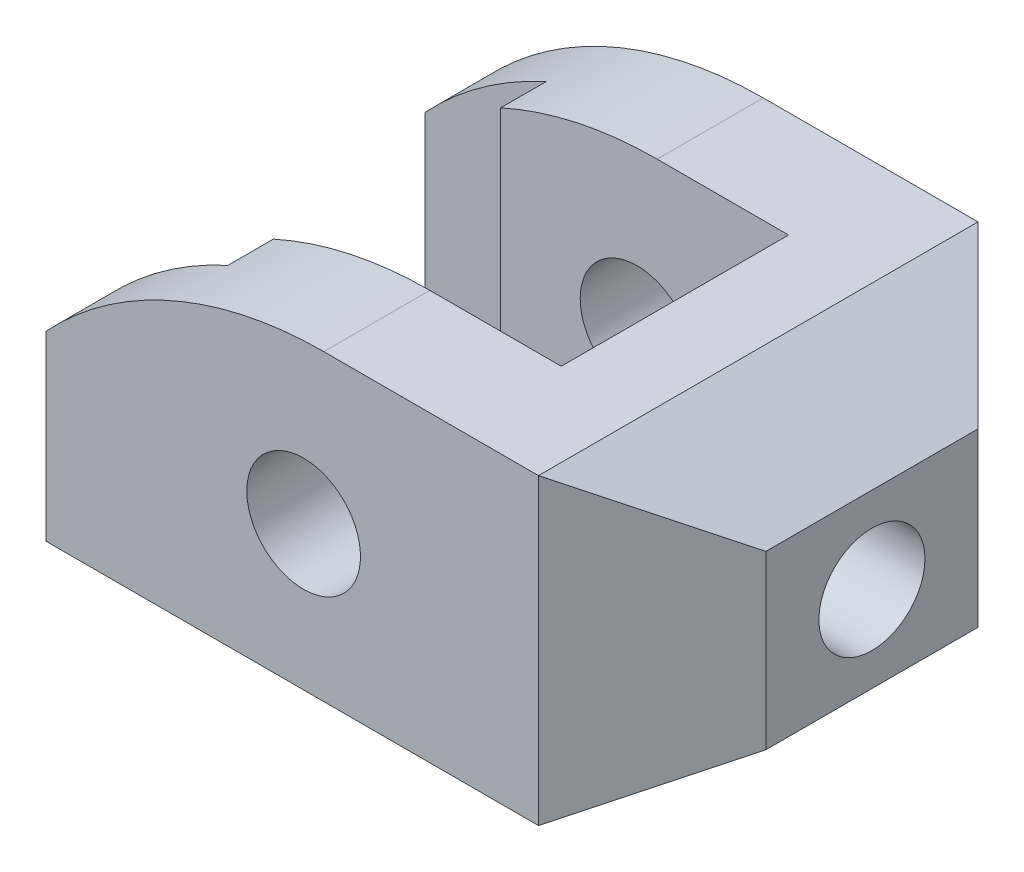
ISO-10303-21;
HEADER;
FILE_DESCRIPTION(('STEP AP214'),'2;1');
FILE_NAME('part.step','',(''),(''),'','','');
FILE_SCHEMA(('AUTOMOTIVE_DESIGN { 1 0 10303 214 1 1 1 1 }'));
ENDSEC;
DATA;
#1=APPLICATION_CONTEXT('core data for automotive mechanical design processes');
#2=APPLICATION_PROTOCOL_DEFINITION('international standard','automotive_design',2000,#1);
#3=PRODUCT_CONTEXT('',#1,'mechanical');
#4=PRODUCT('Part','Part','',(#3));
#5=PRODUCT_RELATED_PRODUCT_CATEGORY('part','',(#4));
#6=PRODUCT_DEFINITION_FORMATION('','',#4);
#7=PRODUCT_DEFINITION_CONTEXT('part definition',#1,'design');
#8=PRODUCT_DEFINITION('design','',#6,#7);
#9=PRODUCT_DEFINITION_SHAPE('','',#8);
#10=(LENGTH_UNIT() NAMED_UNIT(*) SI_UNIT(.MILLI.,.METRE.));
#11=(NAMED_UNIT(*) PLANE_ANGLE_UNIT() SI_UNIT($,.RADIAN.));
#12=(NAMED_UNIT(*) SI_UNIT($,.STERADIAN.) SOLID_ANGLE_UNIT());
#13=UNCERTAINTY_MEASURE_WITH_UNIT(LENGTH_MEASURE(1.E-05),#10,'distance_accuracy_value','');
#14=(GEOMETRIC_REPRESENTATION_CONTEXT(3) GLOBAL_UNCERTAINTY_ASSIGNED_CONTEXT((#13)) GLOBAL_UNIT_ASSIGNED_CONTEXT((#10,
#11,#12)) REPRESENTATION_CONTEXT('',''));
#15=CARTESIAN_POINT('',(0.,0.,0.));
#16=DIRECTION('',(0.,0.,1.));
#17=DIRECTION('',(1.,0.,0.));
#18=AXIS2_PLACEMENT_3D('',#15,#16,#17);
#19=CARTESIAN_POINT('',(2.66060555964673,-29.,58.));
#20=DIRECTION('',(0.,0.,-1.));
#21=DIRECTION('',(-1.,0.,0.));
#22=AXIS2_PLACEMENT_3D('',#19,#20,#21);
#23=CYLINDRICAL_SURFACE('',#22,50.);
#24=DIRECTION('',(0.,0.,-1.));
#25=VECTOR('',#24,1.);
#26=CARTESIAN_POINT('',(-18.,16.5317403347236,58.));
#27=LINE('',#26,#25);
#28=CARTESIAN_POINT('',(-18.,16.5317403347236,44.));
#29=VERTEX_POINT('',#28);
#30=CARTESIAN_POINT('',(-18.,16.5317403347236,50.));
#31=VERTEX_POINT('',#30);
#32=EDGE_CURVE('E276',#29,#31,#27,.F.);
#33=ORIENTED_EDGE('',*,*,#32,.T.);
#34=CARTESIAN_POINT('',(2.66060555964673,-29.,50.));
#35=DIRECTION('',(0.,0.,1.));
#36=DIRECTION('',(1.,0.,0.));
#37=AXIS2_PLACEMENT_3D('',#34,#35,#36);
#38=CIRCLE('',#37,50.);
#39=CARTESIAN_POINT('',(-34.,5.00000000000001,50.));
#40=VERTEX_POINT('',#39);
#41=EDGE_CURVE('E279',#31,#40,#38,.T.);
#42=ORIENTED_EDGE('',*,*,#41,.T.);
#43=DIRECTION('',(0.,0.,-1.));
#44=VECTOR('',#43,1.);
#45=CARTESIAN_POINT('',(-34.,5.,58.));
#46=LINE('',#45,#44);
#47=CARTESIAN_POINT('',(-34.,5.,58.));
#48=VERTEX_POINT('',#47);
#49=EDGE_CURVE('E190',#48,#40,#46,.T.);
#50=ORIENTED_EDGE('',*,*,#49,.F.);
#51=CARTESIAN_POINT('',(2.66060555964673,-29.,58.));
#52=DIRECTION('',(0.,0.,1.));
#53=DIRECTION('',(-1.,0.,0.));
#54=AXIS2_PLACEMENT_3D('',#51,#52,#53);
#55=CIRCLE('',#54,50.);
#56=CARTESIAN_POINT('',(2.66060555964672,21.,58.));
#57=VERTEX_POINT('',#56);
#58=EDGE_CURVE('E289',#57,#48,#55,.T.);
#59=ORIENTED_EDGE('',*,*,#58,.F.);
#60=DIRECTION('',(0.,0.,-1.));
#61=VECTOR('',#60,1.);
#62=CARTESIAN_POINT('',(2.66060555964672,21.,58.));
#63=LINE('',#62,#61);
#64=CARTESIAN_POINT('',(2.66060555964672,21.,44.));
#65=VERTEX_POINT('',#64);
#66=EDGE_CURVE('E307',#57,#65,#63,.T.);
#67=ORIENTED_EDGE('',*,*,#66,.T.);
#68=CARTESIAN_POINT('',(2.66060555964673,-29.,44.));
#69=DIRECTION('',(0.,0.,1.));
#70=DIRECTION('',(1.,0.,0.));
#71=AXIS2_PLACEMENT_3D('',#68,#69,#70);
#72=CIRCLE('',#71,50.);
#73=EDGE_CURVE('E267',#65,#29,#72,.T.);
#74=ORIENTED_EDGE('',*,*,#73,.T.);
#75=EDGE_LOOP('',(#33,#42,#50,#59,#67,#74));
#76=FACE_BOUND('',#75,.T.);
#77=ADVANCED_FACE('F43',(#76),#23,.T.);
#78=CARTESIAN_POINT('',(-34.,5.,58.));
#79=DIRECTION('',(1.,0.,0.));
#80=DIRECTION('',(0.,1.,0.));
#81=AXIS2_PLACEMENT_3D('',#78,#79,#80);
#82=PLANE('',#81);
#83=ORIENTED_EDGE('',*,*,#49,.T.);
#84=DIRECTION('',(0.,-1.,0.));
#85=VECTOR('',#84,1.);
#86=CARTESIAN_POINT('',(-34.,39.,50.));
#87=LINE('',#86,#85);
#88=CARTESIAN_POINT('',(-34.,-19.,50.));
#89=VERTEX_POINT('',#88);
#90=EDGE_CURVE('E198',#40,#89,#87,.T.);
#91=ORIENTED_EDGE('',*,*,#90,.T.);
#92=DIRECTION('',(0.,0.,-1.));
#93=VECTOR('',#92,1.);
#94=CARTESIAN_POINT('',(-34.,-19.,58.));
#95=LINE('',#94,#93);
#96=CARTESIAN_POINT('',(-34.,-19.,58.));
#97=VERTEX_POINT('',#96);
#98=EDGE_CURVE('E186',#97,#89,#95,.T.);
#99=ORIENTED_EDGE('',*,*,#98,.F.);
#100=DIRECTION('',(0.,-1.,0.));
#101=VECTOR('',#100,1.);
#102=CARTESIAN_POINT('',(-34.,5.,58.));
#103=LINE('',#102,#101);
#104=EDGE_CURVE('E291',#48,#97,#103,.T.);
#105=ORIENTED_EDGE('',*,*,#104,.F.);
#106=EDGE_LOOP('',(#83,#91,#99,#105));
#107=FACE_BOUND('',#106,.T.);
#108=ADVANCED_FACE('F352',(#107),#82,.F.);
#109=CARTESIAN_POINT('',(0.,0.,58.));
#110=DIRECTION('',(0.,0.,-1.));
#111=DIRECTION('',(-1.,0.,0.));
#112=AXIS2_PLACEMENT_3D('',#109,#110,#111);
#113=CYLINDRICAL_SURFACE('',#112,7.5);
#114=CARTESIAN_POINT('',(0.,0.,44.));
#115=DIRECTION('',(0.,0.,1.));
#116=DIRECTION('',(1.,0.,0.));
#117=AXIS2_PLACEMENT_3D('',#114,#115,#116);
#118=CIRCLE('',#117,7.5);
#119=CARTESIAN_POINT('',(-7.5,0.,44.));
#120=VERTEX_POINT('',#119);
#121=EDGE_CURVE('E199',#120,#120,#118,.T.);
#122=CARTESIAN_POINT('',(0.,0.,58.));
#123=DIRECTION('',(0.,0.,1.));
#124=DIRECTION('',(1.,0.,0.));
#125=AXIS2_PLACEMENT_3D('',#122,#123,#124);
#126=CIRCLE('',#125,7.5);
#127=CARTESIAN_POINT('',(-7.5,0.,58.));
#128=VERTEX_POINT('',#127);
#129=EDGE_CURVE('E283',#128,#128,#126,.T.);
#130=CARTESIAN_POINT('',(-7.5,0.,44.));
#131=CARTESIAN_POINT('',(-7.5,0.,44.1458333333333));
#132=CARTESIAN_POINT('',(-7.5,0.,44.2916666666667));
#133=CARTESIAN_POINT('',(-7.5,0.,44.5833333333333));
#134=CARTESIAN_POINT('',(-7.5,0.,44.7291666666667));
#135=CARTESIAN_POINT('',(-7.5,0.,45.0208333333333));
#136=CARTESIAN_POINT('',(-7.5,0.,45.1666666666667));
#137=CARTESIAN_POINT('',(-7.5,0.,45.4583333333333));
#138=CARTESIAN_POINT('',(-7.5,0.,45.6041666666667));
#139=CARTESIAN_POINT('',(-7.5,0.,45.8958333333333));
#140=CARTESIAN_POINT('',(-7.5,0.,46.0416666666667));
#141=CARTESIAN_POINT('',(-7.5,0.,46.3333333333333));
#142=CARTESIAN_POINT('',(-7.5,0.,46.4791666666667));
#143=CARTESIAN_POINT('',(-7.5,0.,46.7708333333333));
#144=CARTESIAN_POINT('',(-7.5,0.,46.9166666666667));
#145=CARTESIAN_POINT('',(-7.5,0.,47.2083333333333));
#146=CARTESIAN_POINT('',(-7.5,0.,47.3541666666667));
#147=CARTESIAN_POINT('',(-7.5,0.,47.6458333333333));
#148=CARTESIAN_POINT('',(-7.5,0.,47.7916666666667));
#149=CARTESIAN_POINT('',(-7.5,0.,48.0833333333333));
#150=CARTESIAN_POINT('',(-7.5,0.,48.2291666666667));
#151=CARTESIAN_POINT('',(-7.5,0.,48.5208333333333));
#152=CARTESIAN_POINT('',(-7.5,0.,48.6666666666667));
#153=CARTESIAN_POINT('',(-7.5,0.,48.9583333333333));
#154=CARTESIAN_POINT('',(-7.5,0.,49.1041666666667));
#155=CARTESIAN_POINT('',(-7.5,0.,49.3958333333333));
#156=CARTESIAN_POINT('',(-7.5,0.,49.5416666666667));
#157=CARTESIAN_POINT('',(-7.5,0.,49.8333333333333));
#158=CARTESIAN_POINT('',(-7.5,0.,49.9791666666667));
#159=CARTESIAN_POINT('',(-7.5,0.,50.2708333333333));
#160=CARTESIAN_POINT('',(-7.5,0.,50.4166666666667));
#161=CARTESIAN_POINT('',(-7.5,0.,50.7083333333333));
#162=CARTESIAN_POINT('',(-7.5,0.,50.8541666666667));
#163=CARTESIAN_POINT('',(-7.5,0.,51.1458333333333));
#164=CARTESIAN_POINT('',(-7.5,0.,51.2916666666667));
#165=CARTESIAN_POINT('',(-7.5,0.,51.5833333333333));
#166=CARTESIAN_POINT('',(-7.5,0.,51.7291666666667));
#167=CARTESIAN_POINT('',(-7.5,0.,52.0208333333333));
#168=CARTESIAN_POINT('',(-7.5,0.,52.1666666666667));
#169=CARTESIAN_POINT('',(-7.5,0.,52.4583333333333));
#170=CARTESIAN_POINT('',(-7.5,0.,52.6041666666667));
#171=CARTESIAN_POINT('',(-7.5,0.,52.8958333333333));
#172=CARTESIAN_POINT('',(-7.5,0.,53.0416666666667));
#173=CARTESIAN_POINT('',(-7.5,0.,53.3333333333333));
#174=CARTESIAN_POINT('',(-7.5,0.,53.4791666666667));
#175=CARTESIAN_POINT('',(-7.5,0.,53.7708333333333));
#176=CARTESIAN_POINT('',(-7.5,0.,53.9166666666667));
#177=CARTESIAN_POINT('',(-7.5,0.,54.2083333333333));
#178=CARTESIAN_POINT('',(-7.5,0.,54.3541666666667));
#179=CARTESIAN_POINT('',(-7.5,0.,54.6458333333333));
#180=CARTESIAN_POINT('',(-7.5,0.,54.7916666666667));
#181=CARTESIAN_POINT('',(-7.5,0.,55.0833333333333));
#182=CARTESIAN_POINT('',(-7.5,0.,55.2291666666667));
#183=CARTESIAN_POINT('',(-7.5,0.,55.5208333333333));
#184=CARTESIAN_POINT('',(-7.5,0.,55.6666666666667));
#185=CARTESIAN_POINT('',(-7.5,0.,55.9583333333333));
#186=CARTESIAN_POINT('',(-7.5,0.,56.1041666666667));
#187=CARTESIAN_POINT('',(-7.5,0.,56.3958333333333));
#188=CARTESIAN_POINT('',(-7.5,0.,56.5416666666667));
#189=CARTESIAN_POINT('',(-7.5,0.,56.8333333333333));
#190=CARTESIAN_POINT('',(-7.5,0.,56.9791666666667));
#191=CARTESIAN_POINT('',(-7.5,0.,57.2708333333333));
#192=CARTESIAN_POINT('',(-7.5,0.,57.4166666666667));
#193=CARTESIAN_POINT('',(-7.5,0.,57.7083333333333));
#194=CARTESIAN_POINT('',(-7.5,0.,57.8541666666667));
#195=CARTESIAN_POINT('',(-7.5,0.,58.));
#196=B_SPLINE_CURVE_WITH_KNOTS('',3,(#130,#131,#132,#133,#134,#135,#136,#137,#138,#139,#140,
#141,#142,#143,#144,#145,#146,#147,#148,#149,#150,#151,#152,#153,#154,#155,#156,#157,#158,#159,
#160,#161,#162,#163,#164,#165,#166,#167,#168,#169,#170,#171,#172,#173,#174,#175,#176,#177,#178,
#179,#180,#181,#182,#183,#184,#185,#186,#187,#188,#189,#190,#191,#192,#193,#194,#195),
.UNSPECIFIED.,.F.,.F.,(4,2,2,2,2,2,2,2,2,2,2,2,2,2,2,2,2,2,2,2,2,2,2,2,2,2,2,2,2,2,2,2,4),(0.,
0.4375,0.875000000000001,1.3125,1.74999999999999,2.1875,2.625,3.0625,3.5,3.9375,4.375,4.8125,
5.25,5.6875,6.125,6.5625,7.,7.4375,7.875,8.31249999999999,8.74999999999999,9.18749999999999,
9.62499999999999,10.0625,10.5,10.9375,11.375,11.8125,12.25,12.6875,13.125,13.5625,14.),.UNSPECIFIED.);
#197=EDGE_CURVE('BSEAM373',#120,#128,#196,.T.);
#198=ORIENTED_EDGE('',*,*,#121,.F.);
#199=ORIENTED_EDGE('',*,*,#129,.T.);
#200=ORIENTED_EDGE('',*,*,#197,.T.);
#201=ORIENTED_EDGE('',*,*,#197,.F.);
#202=EDGE_LOOP('',(#198,#200,#199,#201));
#203=FACE_BOUND('',#202,.T.);
#204=ADVANCED_FACE('F373',(#203),#113,.F.);
#205=CARTESIAN_POINT('',(2.66060555964673,-29.,58.));
#206=DIRECTION('',(0.,0.,-1.));
#207=DIRECTION('',(-1.,0.,0.));
#208=AXIS2_PLACEMENT_3D('',#205,#206,#207);
#209=PLANE('',#208);
#210=DIRECTION('',(1.,0.,0.));
#211=VECTOR('',#210,1.);
#212=CARTESIAN_POINT('',(-34.,-19.,58.));
#213=LINE('',#212,#211);
#214=CARTESIAN_POINT('',(31.,-19.,58.));
#215=VERTEX_POINT('',#214);
#216=EDGE_CURVE('E218',#97,#215,#213,.T.);
#217=ORIENTED_EDGE('',*,*,#216,.T.);
#218=DIRECTION('',(0.,1.,0.));
#219=VECTOR('',#218,1.);
#220=CARTESIAN_POINT('',(31.,-29.,58.));
#221=LINE('',#220,#219);
#222=CARTESIAN_POINT('',(31.,21.,58.));
#223=VERTEX_POINT('',#222);
#224=EDGE_CURVE('E158',#215,#223,#221,.T.);
#225=ORIENTED_EDGE('',*,*,#224,.T.);
#226=DIRECTION('',(-1.,0.,0.));
#227=VECTOR('',#226,1.);
#228=CARTESIAN_POINT('',(31.,21.,58.));
#229=LINE('',#228,#227);
#230=EDGE_CURVE('E215',#223,#57,#229,.T.);
#231=ORIENTED_EDGE('',*,*,#230,.T.);
#232=ORIENTED_EDGE('',*,*,#58,.T.);
#233=ORIENTED_EDGE('',*,*,#104,.T.);
#234=EDGE_LOOP('',(#217,#225,#231,#232,#233));
#235=FACE_BOUND('',#234,.T.);
#236=ORIENTED_EDGE('',*,*,#129,.F.);
#237=EDGE_LOOP('',(#236));
#238=FACE_BOUND('',#237,.T.);
#239=ADVANCED_FACE('F212',(#235,#238),#209,.F.);
#240=CARTESIAN_POINT('',(2.66060555964673,-29.,0.));
#241=DIRECTION('',(0.,0.,-1.));
#242=DIRECTION('',(-1.,0.,0.));
#243=AXIS2_PLACEMENT_3D('',#240,#241,#242);
#244=PLANE('',#243);
#245=DIRECTION('',(0.,1.,0.));
#246=VECTOR('',#245,1.);
#247=CARTESIAN_POINT('',(31.,-29.,0.));
#248=LINE('',#247,#246);
#249=CARTESIAN_POINT('',(31.,-19.,0.));
#250=VERTEX_POINT('',#249);
#251=CARTESIAN_POINT('',(31.,21.,0.));
#252=VERTEX_POINT('',#251);
#253=EDGE_CURVE('E164',#250,#252,#248,.T.);
#254=ORIENTED_EDGE('',*,*,#253,.F.);
#255=DIRECTION('',(1.,0.,0.));
#256=VECTOR('',#255,1.);
#257=CARTESIAN_POINT('',(-34.,-19.,0.));
#258=LINE('',#257,#256);
#259=CARTESIAN_POINT('',(-34.,-19.,0.));
#260=VERTEX_POINT('',#259);
#261=EDGE_CURVE('E302',#260,#250,#258,.T.);
#262=ORIENTED_EDGE('',*,*,#261,.F.);
#263=DIRECTION('',(0.,-1.,0.));
#264=VECTOR('',#263,1.);
#265=CARTESIAN_POINT('',(-34.,5.,0.));
#266=LINE('',#265,#264);
#267=CARTESIAN_POINT('',(-34.,5.,0.));
#268=VERTEX_POINT('',#267);
#269=EDGE_CURVE('E299',#268,#260,#266,.T.);
#270=ORIENTED_EDGE('',*,*,#269,.F.);
#271=CARTESIAN_POINT('',(2.66060555964673,-29.,0.));
#272=DIRECTION('',(0.,0.,1.));
#273=DIRECTION('',(-1.,0.,0.));
#274=AXIS2_PLACEMENT_3D('',#271,#272,#273);
#275=CIRCLE('',#274,50.);
#276=CARTESIAN_POINT('',(2.66060555964672,21.,0.));
#277=VERTEX_POINT('',#276);
#278=EDGE_CURVE('E286',#277,#268,#275,.T.);
#279=ORIENTED_EDGE('',*,*,#278,.F.);
#280=DIRECTION('',(-1.,0.,0.));
#281=VECTOR('',#280,1.);
#282=CARTESIAN_POINT('',(31.,21.,0.));
#283=LINE('',#282,#281);
#284=EDGE_CURVE('E292',#252,#277,#283,.T.);
#285=ORIENTED_EDGE('',*,*,#284,.F.);
#286=EDGE_LOOP('',(#254,#262,#270,#279,#285));
#287=FACE_BOUND('',#286,.T.);
#288=CARTESIAN_POINT('',(0.,0.,0.));
#289=DIRECTION('',(0.,0.,1.));
#290=DIRECTION('',(1.,0.,0.));
#291=AXIS2_PLACEMENT_3D('',#288,#289,#290);
#292=CIRCLE('',#291,7.5);
#293=CARTESIAN_POINT('',(-7.5,0.,0.));
#294=VERTEX_POINT('',#293);
#295=EDGE_CURVE('E282',#294,#294,#292,.T.);
#296=ORIENTED_EDGE('',*,*,#295,.T.);
#297=EDGE_LOOP('',(#296));
#298=FACE_BOUND('',#297,.T.);
#299=ADVANCED_FACE('F316',(#287,#298),#244,.T.);
#300=DIRECTION('',(0.,0.,-1.));
#301=VECTOR('',#300,1.);
#302=CARTESIAN_POINT('',(-18.,16.5317403347236,58.));
#303=LINE('',#302,#301);
#304=CARTESIAN_POINT('',(-18.,16.5317403347236,8.));
#305=VERTEX_POINT('',#304);
#306=CARTESIAN_POINT('',(-18.,16.5317403347236,14.));
#307=VERTEX_POINT('',#306);
#308=EDGE_CURVE('E273',#305,#307,#303,.F.);
#309=ORIENTED_EDGE('',*,*,#308,.T.);
#310=CARTESIAN_POINT('',(2.66060555964673,-29.,14.));
#311=DIRECTION('',(0.,0.,-1.));
#312=DIRECTION('',(-1.,0.,0.));
#313=AXIS2_PLACEMENT_3D('',#310,#311,#312);
#314=CIRCLE('',#313,50.);
#315=CARTESIAN_POINT('',(2.66060555964672,21.,14.));
#316=VERTEX_POINT('',#315);
#317=EDGE_CURVE('E203',#307,#316,#314,.T.);
#318=ORIENTED_EDGE('',*,*,#317,.T.);
#319=EDGE_CURVE('E296',#316,#277,#63,.T.);
#320=ORIENTED_EDGE('',*,*,#319,.T.);
#321=ORIENTED_EDGE('',*,*,#278,.T.);
#322=CARTESIAN_POINT('',(-34.,5.00000000000001,8.));
#323=VERTEX_POINT('',#322);
#324=EDGE_CURVE('E189',#323,#268,#46,.T.);
#325=ORIENTED_EDGE('',*,*,#324,.F.);
#326=CARTESIAN_POINT('',(2.66060555964673,-29.,8.));
#327=DIRECTION('',(0.,0.,-1.));
#328=DIRECTION('',(-1.,0.,0.));
#329=AXIS2_PLACEMENT_3D('',#326,#327,#328);
#330=CIRCLE('',#329,50.);
#331=EDGE_CURVE('E270',#323,#305,#330,.T.);
#332=ORIENTED_EDGE('',*,*,#331,.T.);
#333=EDGE_LOOP('',(#309,#318,#320,#321,#325,#332));
#334=FACE_BOUND('',#333,.T.);
#335=ADVANCED_FACE('F45',(#334),#23,.T.);
#336=CARTESIAN_POINT('',(-34.,-19.,8.));
#337=VERTEX_POINT('',#336);
#338=EDGE_CURVE('E180',#337,#260,#95,.T.);
#339=ORIENTED_EDGE('',*,*,#338,.F.);
#340=DIRECTION('',(0.,-1.,0.));
#341=VECTOR('',#340,1.);
#342=CARTESIAN_POINT('',(-34.,39.,8.));
#343=LINE('',#342,#341);
#344=EDGE_CURVE('E246',#323,#337,#343,.T.);
#345=ORIENTED_EDGE('',*,*,#344,.F.);
#346=ORIENTED_EDGE('',*,*,#324,.T.);
#347=ORIENTED_EDGE('',*,*,#269,.T.);
#348=EDGE_LOOP('',(#339,#345,#346,#347));
#349=FACE_BOUND('',#348,.T.);
#350=ADVANCED_FACE('F335',(#349),#82,.F.);
#351=CARTESIAN_POINT('',(-34.,-19.,58.));
#352=DIRECTION('',(0.,1.,0.));
#353=DIRECTION('',(-1.,0.,0.));
#354=AXIS2_PLACEMENT_3D('',#351,#352,#353);
#355=PLANE('',#354);
#356=ORIENTED_EDGE('',*,*,#98,.T.);
#357=DIRECTION('',(-1.,0.,0.));
#358=VECTOR('',#357,1.);
#359=CARTESIAN_POINT('',(-34.,-19.,50.));
#360=LINE('',#359,#358);
#361=CARTESIAN_POINT('',(-18.,-19.,50.));
#362=VERTEX_POINT('',#361);
#363=EDGE_CURVE('E244',#362,#89,#360,.T.);
#364=ORIENTED_EDGE('',*,*,#363,.F.);
#365=DIRECTION('',(0.,0.,1.));
#366=VECTOR('',#365,1.);
#367=CARTESIAN_POINT('',(-18.,-19.,50.));
#368=LINE('',#367,#366);
#369=CARTESIAN_POINT('',(-18.,-19.,44.));
#370=VERTEX_POINT('',#369);
#371=EDGE_CURVE('E241',#370,#362,#368,.T.);
#372=ORIENTED_EDGE('',*,*,#371,.F.);
#373=DIRECTION('',(-1.,0.,0.));
#374=VECTOR('',#373,1.);
#375=CARTESIAN_POINT('',(-18.,-19.,44.));
#376=LINE('',#375,#374);
#377=CARTESIAN_POINT('',(20.,-19.,44.));
#378=VERTEX_POINT('',#377);
#379=EDGE_CURVE('E238',#378,#370,#376,.T.);
#380=ORIENTED_EDGE('',*,*,#379,.F.);
#381=DIRECTION('',(0.,0.,1.));
#382=VECTOR('',#381,1.);
#383=CARTESIAN_POINT('',(20.,-19.,44.));
#384=LINE('',#383,#382);
#385=CARTESIAN_POINT('',(20.,-19.,14.));
#386=VERTEX_POINT('',#385);
#387=EDGE_CURVE('E235',#386,#378,#384,.T.);
#388=ORIENTED_EDGE('',*,*,#387,.F.);
#389=DIRECTION('',(1.,0.,0.));
#390=VECTOR('',#389,1.);
#391=CARTESIAN_POINT('',(20.,-19.,14.));
#392=LINE('',#391,#390);
#393=CARTESIAN_POINT('',(-18.,-19.,14.));
#394=VERTEX_POINT('',#393);
#395=EDGE_CURVE('E233',#394,#386,#392,.T.);
#396=ORIENTED_EDGE('',*,*,#395,.F.);
#397=DIRECTION('',(0.,0.,1.));
#398=VECTOR('',#397,1.);
#399=CARTESIAN_POINT('',(-18.,-19.,14.));
#400=LINE('',#399,#398);
#401=CARTESIAN_POINT('',(-18.,-19.,8.));
#402=VERTEX_POINT('',#401);
#403=EDGE_CURVE('E230',#402,#394,#400,.T.);
#404=ORIENTED_EDGE('',*,*,#403,.F.);
#405=DIRECTION('',(1.,0.,0.));
#406=VECTOR('',#405,1.);
#407=CARTESIAN_POINT('',(-18.,-19.,8.));
#408=LINE('',#407,#406);
#409=EDGE_CURVE('E227',#337,#402,#408,.T.);
#410=ORIENTED_EDGE('',*,*,#409,.F.);
#411=ORIENTED_EDGE('',*,*,#338,.T.);
#412=ORIENTED_EDGE('',*,*,#261,.T.);
#413=DIRECTION('',(0.,0.,-1.));
#414=VECTOR('',#413,1.);
#415=CARTESIAN_POINT('',(31.,-19.,58.));
#416=LINE('',#415,#414);
#417=EDGE_CURVE('E178',#215,#250,#416,.T.);
#418=ORIENTED_EDGE('',*,*,#417,.F.);
#419=ORIENTED_EDGE('',*,*,#216,.F.);
#420=EDGE_LOOP('',(#356,#364,#372,#380,#388,#396,#404,#410,#411,#412,#418,#419));
#421=FACE_BOUND('',#420,.T.);
#422=ADVANCED_FACE('F337',(#421),#355,.F.);
#423=CARTESIAN_POINT('',(31.,-19.,58.));
#424=DIRECTION('',(-0.500000000000001,0.866025403784438,0.));
#425=DIRECTION('',(-0.866025403784438,-0.500000000000001,0.));
#426=AXIS2_PLACEMENT_3D('',#423,#424,#425);
#427=PLANE('',#426);
#428=ORIENTED_EDGE('',*,*,#417,.T.);
#429=DIRECTION('',(0.654653670707976,0.377964473009228,0.654653670707978));
#430=VECTOR('',#429,1.);
#431=CARTESIAN_POINT('',(55.8571428571428,-4.64872188014355,24.8571428571429));
#432=LINE('',#431,#430);
#433=CARTESIAN_POINT('',(46.,-10.3397459621556,15.0000000000001));
#434=VERTEX_POINT('',#433);
#435=EDGE_CURVE('E163',#250,#434,#432,.T.);
#436=ORIENTED_EDGE('',*,*,#435,.T.);
#437=DIRECTION('',(0.,0.,-1.));
#438=VECTOR('',#437,1.);
#439=CARTESIAN_POINT('',(46.,-10.3397459621556,58.));
#440=LINE('',#439,#438);
#441=CARTESIAN_POINT('',(46.,-10.3397459621556,43.0000000000002));
#442=VERTEX_POINT('',#441);
#443=EDGE_CURVE('E171',#442,#434,#440,.T.);
#444=ORIENTED_EDGE('',*,*,#443,.F.);
#445=DIRECTION('',(-0.65465367070798,-0.37796447300923,0.654653670707973));
#446=VECTOR('',#445,1.);
#447=CARTESIAN_POINT('',(31.,-19.,58.));
#448=LINE('',#447,#446);
#449=EDGE_CURVE('E155',#442,#215,#448,.T.);
#450=ORIENTED_EDGE('',*,*,#449,.T.);
#451=EDGE_LOOP('',(#428,#436,#444,#450));
#452=FACE_BOUND('',#451,.T.);
#453=ADVANCED_FACE('F177',(#452),#427,.F.);
#454=CARTESIAN_POINT('',(46.,-10.3397459621556,58.));
#455=DIRECTION('',(-1.,0.,0.));
#456=DIRECTION('',(0.,0.,1.));
#457=AXIS2_PLACEMENT_3D('',#454,#455,#456);
#458=PLANE('',#457);
#459=CARTESIAN_POINT('',(46.,1.00000000000007,29.0000000000001));
#460=DIRECTION('',(-1.,0.,0.));
#461=DIRECTION('',(0.,0.,1.));
#462=AXIS2_PLACEMENT_3D('',#459,#460,#461);
#463=CIRCLE('',#462,7.);
#464=CARTESIAN_POINT('',(46.,1.00000000000007,22.0000000000001));
#465=VERTEX_POINT('',#464);
#466=EDGE_CURVE('E220',#465,#465,#463,.T.);
#467=ORIENTED_EDGE('',*,*,#466,.T.);
#468=EDGE_LOOP('',(#467));
#469=FACE_BOUND('',#468,.T.);
#470=ORIENTED_EDGE('',*,*,#443,.T.);
#471=DIRECTION('',(0.,1.,0.));
#472=VECTOR('',#471,1.);
#473=CARTESIAN_POINT('',(46.,-29.,15.0000000000001));
#474=LINE('',#473,#472);
#475=CARTESIAN_POINT('',(46.,12.3397459621557,15.0000000000001));
#476=VERTEX_POINT('',#475);
#477=EDGE_CURVE('E174',#434,#476,#474,.T.);
#478=ORIENTED_EDGE('',*,*,#477,.T.);
#479=DIRECTION('',(0.,0.,-1.));
#480=VECTOR('',#479,1.);
#481=CARTESIAN_POINT('',(46.,12.3397459621557,58.));
#482=LINE('',#481,#480);
#483=CARTESIAN_POINT('',(46.,12.3397459621557,43.0000000000002));
#484=VERTEX_POINT('',#483);
#485=EDGE_CURVE('E173',#484,#476,#482,.T.);
#486=ORIENTED_EDGE('',*,*,#485,.F.);
#487=DIRECTION('',(0.,1.,0.));
#488=VECTOR('',#487,1.);
#489=CARTESIAN_POINT('',(46.,-29.,43.0000000000002));
#490=LINE('',#489,#488);
#491=EDGE_CURVE('E59',#442,#484,#490,.T.);
#492=ORIENTED_EDGE('',*,*,#491,.F.);
#493=EDGE_LOOP('',(#470,#478,#486,#492));
#494=FACE_BOUND('',#493,.T.);
#495=ADVANCED_FACE('F169',(#469,#494),#458,.F.);
#496=CARTESIAN_POINT('',(46.,12.3397459621557,58.));
#497=DIRECTION('',(-0.499999999999995,-0.866025403784442,0.));
#498=DIRECTION('',(0.866025403784442,-0.499999999999995,0.));
#499=AXIS2_PLACEMENT_3D('',#496,#497,#498);
#500=PLANE('',#499);
#501=ORIENTED_EDGE('',*,*,#485,.T.);
#502=DIRECTION('',(-0.654653670707978,0.377964473009222,-0.65465367070798));
#503=VECTOR('',#502,1.);
#504=CARTESIAN_POINT('',(64.4285714285715,1.70000528708988,33.4285714285716));
#505=LINE('',#504,#503);
#506=EDGE_CURVE('E11',#476,#252,#505,.T.);
#507=ORIENTED_EDGE('',*,*,#506,.T.);
#508=DIRECTION('',(0.,0.,-1.));
#509=VECTOR('',#508,1.);
#510=CARTESIAN_POINT('',(31.,21.,58.));
#511=LINE('',#510,#509);
#512=EDGE_CURVE('E182',#223,#252,#511,.T.);
#513=ORIENTED_EDGE('',*,*,#512,.F.);
#514=DIRECTION('',(0.654653670707981,-0.377964473009225,-0.654653670707974));
#515=VECTOR('',#514,1.);
#516=CARTESIAN_POINT('',(39.5714285714286,16.0512834069461,49.4285714285715));
#517=LINE('',#516,#515);
#518=EDGE_CURVE('E52',#223,#484,#517,.T.);
#519=ORIENTED_EDGE('',*,*,#518,.T.);
#520=EDGE_LOOP('',(#501,#507,#513,#519));
#521=FACE_BOUND('',#520,.T.);
#522=ADVANCED_FACE('F208',(#521),#500,.F.);
#523=CARTESIAN_POINT('',(31.,21.,58.));
#524=DIRECTION('',(0.,-1.,0.));
#525=DIRECTION('',(1.,0.,0.));
#526=AXIS2_PLACEMENT_3D('',#523,#524,#525);
#527=PLANE('',#526);
#528=DIRECTION('',(0.,0.,1.));
#529=VECTOR('',#528,1.);
#530=CARTESIAN_POINT('',(20.,21.,58.));
#531=LINE('',#530,#529);
#532=CARTESIAN_POINT('',(20.,21.,14.));
#533=VERTEX_POINT('',#532);
#534=CARTESIAN_POINT('',(20.,21.,44.));
#535=VERTEX_POINT('',#534);
#536=EDGE_CURVE('E193',#533,#535,#531,.T.);
#537=ORIENTED_EDGE('',*,*,#536,.T.);
#538=DIRECTION('',(-1.,0.,0.));
#539=VECTOR('',#538,1.);
#540=CARTESIAN_POINT('',(31.,21.,44.));
#541=LINE('',#540,#539);
#542=EDGE_CURVE('E202',#535,#65,#541,.T.);
#543=ORIENTED_EDGE('',*,*,#542,.T.);
#544=ORIENTED_EDGE('',*,*,#66,.F.);
#545=ORIENTED_EDGE('',*,*,#230,.F.);
#546=ORIENTED_EDGE('',*,*,#512,.T.);
#547=ORIENTED_EDGE('',*,*,#284,.T.);
#548=ORIENTED_EDGE('',*,*,#319,.F.);
#549=DIRECTION('',(1.,0.,0.));
#550=VECTOR('',#549,1.);
#551=CARTESIAN_POINT('',(31.,21.,14.));
#552=LINE('',#551,#550);
#553=EDGE_CURVE('E197',#316,#533,#552,.T.);
#554=ORIENTED_EDGE('',*,*,#553,.T.);
#555=EDGE_LOOP('',(#537,#543,#544,#545,#546,#547,#548,#554));
#556=FACE_BOUND('',#555,.T.);
#557=ADVANCED_FACE('F311',(#556),#527,.F.);
#558=CARTESIAN_POINT('',(0.,0.,14.));
#559=DIRECTION('',(0.,0.,-1.));
#560=DIRECTION('',(-1.,0.,0.));
#561=AXIS2_PLACEMENT_3D('',#558,#559,#560);
#562=CIRCLE('',#561,7.5);
#563=CARTESIAN_POINT('',(-7.5,0.,14.));
#564=VERTEX_POINT('',#563);
#565=EDGE_CURVE('E194',#564,#564,#562,.T.);
#566=CARTESIAN_POINT('',(-7.5,0.,14.));
#567=CARTESIAN_POINT('',(-7.5,0.,13.8541666666667));
#568=CARTESIAN_POINT('',(-7.5,0.,13.7083333333333));
#569=CARTESIAN_POINT('',(-7.5,0.,13.4166666666667));
#570=CARTESIAN_POINT('',(-7.5,0.,13.2708333333333));
#571=CARTESIAN_POINT('',(-7.5,0.,12.9791666666667));
#572=CARTESIAN_POINT('',(-7.5,0.,12.8333333333333));
#573=CARTESIAN_POINT('',(-7.5,0.,12.5416666666667));
#574=CARTESIAN_POINT('',(-7.5,0.,12.3958333333333));
#575=CARTESIAN_POINT('',(-7.5,0.,12.1041666666667));
#576=CARTESIAN_POINT('',(-7.5,0.,11.9583333333333));
#577=CARTESIAN_POINT('',(-7.5,0.,11.6666666666667));
#578=CARTESIAN_POINT('',(-7.5,0.,11.5208333333333));
#579=CARTESIAN_POINT('',(-7.5,0.,11.2291666666667));
#580=CARTESIAN_POINT('',(-7.5,0.,11.0833333333333));
#581=CARTESIAN_POINT('',(-7.5,0.,10.7916666666667));
#582=CARTESIAN_POINT('',(-7.5,0.,10.6458333333333));
#583=CARTESIAN_POINT('',(-7.5,0.,10.3541666666667));
#584=CARTESIAN_POINT('',(-7.5,0.,10.2083333333333));
#585=CARTESIAN_POINT('',(-7.5,0.,9.91666666666668));
#586=CARTESIAN_POINT('',(-7.5,0.,9.77083333333334));
#587=CARTESIAN_POINT('',(-7.5,0.,9.47916666666667));
#588=CARTESIAN_POINT('',(-7.5,0.,9.33333333333334));
#589=CARTESIAN_POINT('',(-7.5,0.,9.04166666666667));
#590=CARTESIAN_POINT('',(-7.5,0.,8.89583333333334));
#591=CARTESIAN_POINT('',(-7.5,0.,8.60416666666667));
#592=CARTESIAN_POINT('',(-7.5,0.,8.45833333333334));
#593=CARTESIAN_POINT('',(-7.5,0.,8.16666666666667));
#594=CARTESIAN_POINT('',(-7.5,0.,8.02083333333334));
#595=CARTESIAN_POINT('',(-7.5,0.,7.72916666666667));
#596=CARTESIAN_POINT('',(-7.5,0.,7.58333333333334));
#597=CARTESIAN_POINT('',(-7.5,0.,7.29166666666667));
#598=CARTESIAN_POINT('',(-7.5,0.,7.14583333333334));
#599=CARTESIAN_POINT('',(-7.5,0.,6.85416666666667));
#600=CARTESIAN_POINT('',(-7.5,0.,6.70833333333334));
#601=CARTESIAN_POINT('',(-7.5,0.,6.41666666666667));
#602=CARTESIAN_POINT('',(-7.5,0.,6.27083333333334));
#603=CARTESIAN_POINT('',(-7.5,0.,5.97916666666667));
#604=CARTESIAN_POINT('',(-7.5,0.,5.83333333333334));
#605=CARTESIAN_POINT('',(-7.5,0.,5.54166666666667));
#606=CARTESIAN_POINT('',(-7.5,0.,5.39583333333334));
#607=CARTESIAN_POINT('',(-7.5,0.,5.10416666666667));
#608=CARTESIAN_POINT('',(-7.5,0.,4.95833333333334));
#609=CARTESIAN_POINT('',(-7.5,0.,4.66666666666667));
#610=CARTESIAN_POINT('',(-7.5,0.,4.52083333333334));
#611=CARTESIAN_POINT('',(-7.5,0.,4.22916666666667));
#612=CARTESIAN_POINT('',(-7.5,0.,4.08333333333334));
#613=CARTESIAN_POINT('',(-7.5,0.,3.79166666666667));
#614=CARTESIAN_POINT('',(-7.5,0.,3.64583333333334));
#615=CARTESIAN_POINT('',(-7.5,0.,3.35416666666667));
#616=CARTESIAN_POINT('',(-7.5,0.,3.20833333333334));
#617=CARTESIAN_POINT('',(-7.5,0.,2.91666666666667));
#618=CARTESIAN_POINT('',(-7.5,0.,2.77083333333334));
#619=CARTESIAN_POINT('',(-7.5,0.,2.47916666666667));
#620=CARTESIAN_POINT('',(-7.5,0.,2.33333333333334));
#621=CARTESIAN_POINT('',(-7.5,0.,2.04166666666667));
#622=CARTESIAN_POINT('',(-7.5,0.,1.89583333333333));
#623=CARTESIAN_POINT('',(-7.5,0.,1.60416666666667));
#624=CARTESIAN_POINT('',(-7.5,0.,1.45833333333333));
#625=CARTESIAN_POINT('',(-7.5,0.,1.16666666666667));
#626=CARTESIAN_POINT('',(-7.5,0.,1.02083333333333));
#627=CARTESIAN_POINT('',(-7.5,0.,0.729166666666667));
#628=CARTESIAN_POINT('',(-7.5,0.,0.583333333333334));
#629=CARTESIAN_POINT('',(-7.5,0.,0.291666666666667));
#630=CARTESIAN_POINT('',(-7.5,0.,0.145833333333333));
#631=CARTESIAN_POINT('',(-7.5,0.,0.));
#632=B_SPLINE_CURVE_WITH_KNOTS('',3,(#566,#567,#568,#569,#570,#571,#572,#573,#574,#575,#576,
#577,#578,#579,#580,#581,#582,#583,#584,#585,#586,#587,#588,#589,#590,#591,#592,#593,#594,#595,
#596,#597,#598,#599,#600,#601,#602,#603,#604,#605,#606,#607,#608,#609,#610,#611,#612,#613,#614,
#615,#616,#617,#618,#619,#620,#621,#622,#623,#624,#625,#626,#627,#628,#629,#630,#631),
.UNSPECIFIED.,.F.,.F.,(4,2,2,2,2,2,2,2,2,2,2,2,2,2,2,2,2,2,2,2,2,2,2,2,2,2,2,2,2,2,2,2,4),(0.,
0.4375,0.875000000000001,1.3125,1.75,2.1875,2.625,3.0625,3.5,3.9375,4.375,4.8125,5.25,
5.68750000000001,6.12500000000001,6.56250000000001,7.00000000000001,7.43750000000001,
7.87500000000001,8.31250000000001,8.75000000000001,9.18750000000001,9.62500000000001,10.0625,
10.5,10.9375,11.375,11.8125,12.25,12.6875,13.125,13.5625,14.),.UNSPECIFIED.);
#633=EDGE_CURVE('BSEAM366',#564,#294,#632,.T.);
#634=ORIENTED_EDGE('',*,*,#565,.F.);
#635=ORIENTED_EDGE('',*,*,#295,.F.);
#636=ORIENTED_EDGE('',*,*,#633,.T.);
#637=ORIENTED_EDGE('',*,*,#633,.F.);
#638=EDGE_LOOP('',(#634,#636,#635,#637));
#639=FACE_BOUND('',#638,.T.);
#640=ADVANCED_FACE('F366',(#639),#113,.F.);
#641=CARTESIAN_POINT('',(-34.,39.,50.));
#642=DIRECTION('',(0.,0.,1.));
#643=DIRECTION('',(1.,0.,0.));
#644=AXIS2_PLACEMENT_3D('',#641,#642,#643);
#645=PLANE('',#644);
#646=DIRECTION('',(0.,-1.,0.));
#647=VECTOR('',#646,1.);
#648=CARTESIAN_POINT('',(-18.,39.,50.));
#649=LINE('',#648,#647);
#650=EDGE_CURVE('E249',#31,#362,#649,.T.);
#651=ORIENTED_EDGE('',*,*,#650,.T.);
#652=ORIENTED_EDGE('',*,*,#363,.T.);
#653=ORIENTED_EDGE('',*,*,#90,.F.);
#654=ORIENTED_EDGE('',*,*,#41,.F.);
#655=EDGE_LOOP('',(#651,#652,#653,#654));
#656=FACE_BOUND('',#655,.T.);
#657=ADVANCED_FACE('F355',(#656),#645,.F.);
#658=CARTESIAN_POINT('',(-18.,39.,50.));
#659=DIRECTION('',(1.,0.,0.));
#660=DIRECTION('',(0.,1.,0.));
#661=AXIS2_PLACEMENT_3D('',#658,#659,#660);
#662=PLANE('',#661);
#663=DIRECTION('',(0.,-1.,0.));
#664=VECTOR('',#663,1.);
#665=CARTESIAN_POINT('',(-18.,39.,44.));
#666=LINE('',#665,#664);
#667=EDGE_CURVE('E251',#29,#370,#666,.T.);
#668=ORIENTED_EDGE('',*,*,#667,.T.);
#669=ORIENTED_EDGE('',*,*,#371,.T.);
#670=ORIENTED_EDGE('',*,*,#650,.F.);
#671=ORIENTED_EDGE('',*,*,#32,.F.);
#672=EDGE_LOOP('',(#668,#669,#670,#671));
#673=FACE_BOUND('',#672,.T.);
#674=ADVANCED_FACE('F358',(#673),#662,.F.);
#675=CARTESIAN_POINT('',(-18.,39.,14.));
#676=DIRECTION('',(1.,0.,0.));
#677=DIRECTION('',(0.,1.,0.));
#678=AXIS2_PLACEMENT_3D('',#675,#676,#677);
#679=PLANE('',#678);
#680=DIRECTION('',(0.,-1.,0.));
#681=VECTOR('',#680,1.);
#682=CARTESIAN_POINT('',(-18.,39.,8.));
#683=LINE('',#682,#681);
#684=EDGE_CURVE('E258',#305,#402,#683,.T.);
#685=ORIENTED_EDGE('',*,*,#684,.T.);
#686=ORIENTED_EDGE('',*,*,#403,.T.);
#687=DIRECTION('',(0.,-1.,0.));
#688=VECTOR('',#687,1.);
#689=CARTESIAN_POINT('',(-18.,39.,14.));
#690=LINE('',#689,#688);
#691=EDGE_CURVE('E256',#307,#394,#690,.T.);
#692=ORIENTED_EDGE('',*,*,#691,.F.);
#693=ORIENTED_EDGE('',*,*,#308,.F.);
#694=EDGE_LOOP('',(#685,#686,#692,#693));
#695=FACE_BOUND('',#694,.T.);
#696=ADVANCED_FACE('F325',(#695),#679,.F.);
#697=CARTESIAN_POINT('',(-18.,39.,8.));
#698=DIRECTION('',(0.,0.,-1.));
#699=DIRECTION('',(-1.,0.,0.));
#700=AXIS2_PLACEMENT_3D('',#697,#698,#699);
#701=PLANE('',#700);
#702=ORIENTED_EDGE('',*,*,#344,.T.);
#703=ORIENTED_EDGE('',*,*,#409,.T.);
#704=ORIENTED_EDGE('',*,*,#684,.F.);
#705=ORIENTED_EDGE('',*,*,#331,.F.);
#706=EDGE_LOOP('',(#702,#703,#704,#705));
#707=FACE_BOUND('',#706,.T.);
#708=ADVANCED_FACE('F331',(#707),#701,.F.);
#709=CARTESIAN_POINT('',(20.,39.,44.));
#710=DIRECTION('',(1.,0.,0.));
#711=DIRECTION('',(0.,1.,0.));
#712=AXIS2_PLACEMENT_3D('',#709,#710,#711);
#713=PLANE('',#712);
#714=CARTESIAN_POINT('',(20.,1.00000000000007,29.0000000000001));
#715=DIRECTION('',(1.,0.,0.));
#716=DIRECTION('',(0.,1.,0.));
#717=AXIS2_PLACEMENT_3D('',#714,#715,#716);
#718=CIRCLE('',#717,7.);
#719=CARTESIAN_POINT('',(20.,1.00000000000007,22.0000000000001));
#720=VERTEX_POINT('',#719);
#721=EDGE_CURVE('E47',#720,#720,#718,.T.);
#722=ORIENTED_EDGE('',*,*,#721,.T.);
#723=EDGE_LOOP('',(#722));
#724=FACE_BOUND('',#723,.T.);
#725=DIRECTION('',(0.,-1.,0.));
#726=VECTOR('',#725,1.);
#727=CARTESIAN_POINT('',(20.,39.,14.));
#728=LINE('',#727,#726);
#729=EDGE_CURVE('E67',#533,#386,#728,.T.);
#730=ORIENTED_EDGE('',*,*,#729,.T.);
#731=ORIENTED_EDGE('',*,*,#387,.T.);
#732=DIRECTION('',(0.,-1.,0.));
#733=VECTOR('',#732,1.);
#734=CARTESIAN_POINT('',(20.,39.,44.));
#735=LINE('',#734,#733);
#736=EDGE_CURVE('E253',#535,#378,#735,.T.);
#737=ORIENTED_EDGE('',*,*,#736,.F.);
#738=ORIENTED_EDGE('',*,*,#536,.F.);
#739=EDGE_LOOP('',(#730,#731,#737,#738));
#740=FACE_BOUND('',#739,.T.);
#741=ADVANCED_FACE('F343',(#724,#740),#713,.F.);
#742=CARTESIAN_POINT('',(-18.,39.,44.));
#743=DIRECTION('',(0.,0.,1.));
#744=DIRECTION('',(1.,0.,0.));
#745=AXIS2_PLACEMENT_3D('',#742,#743,#744);
#746=PLANE('',#745);
#747=ORIENTED_EDGE('',*,*,#121,.T.);
#748=EDGE_LOOP('',(#747));
#749=FACE_BOUND('',#748,.T.);
#750=ORIENTED_EDGE('',*,*,#542,.F.);
#751=ORIENTED_EDGE('',*,*,#736,.T.);
#752=ORIENTED_EDGE('',*,*,#379,.T.);
#753=ORIENTED_EDGE('',*,*,#667,.F.);
#754=ORIENTED_EDGE('',*,*,#73,.F.);
#755=EDGE_LOOP('',(#750,#751,#752,#753,#754));
#756=FACE_BOUND('',#755,.T.);
#757=ADVANCED_FACE('F345',(#749,#756),#746,.F.);
#758=CARTESIAN_POINT('',(20.,39.,14.));
#759=DIRECTION('',(0.,0.,-1.));
#760=DIRECTION('',(-1.,0.,0.));
#761=AXIS2_PLACEMENT_3D('',#758,#759,#760);
#762=PLANE('',#761);
#763=ORIENTED_EDGE('',*,*,#565,.T.);
#764=EDGE_LOOP('',(#763));
#765=FACE_BOUND('',#764,.T.);
#766=ORIENTED_EDGE('',*,*,#691,.T.);
#767=ORIENTED_EDGE('',*,*,#395,.T.);
#768=ORIENTED_EDGE('',*,*,#729,.F.);
#769=ORIENTED_EDGE('',*,*,#553,.F.);
#770=ORIENTED_EDGE('',*,*,#317,.F.);
#771=EDGE_LOOP('',(#766,#767,#768,#769,#770));
#772=FACE_BOUND('',#771,.T.);
#773=ADVANCED_FACE('F322',(#765,#772),#762,.F.);
#774=CARTESIAN_POINT('',(46.,-29.,43.0000000000002));
#775=DIRECTION('',(-0.707106781186544,0.,-0.707106781186551));
#776=DIRECTION('',(-0.707106781186551,0.,0.707106781186544));
#777=AXIS2_PLACEMENT_3D('',#774,#775,#776);
#778=PLANE('',#777);
#779=ORIENTED_EDGE('',*,*,#491,.T.);
#780=ORIENTED_EDGE('',*,*,#518,.F.);
#781=ORIENTED_EDGE('',*,*,#224,.F.);
#782=ORIENTED_EDGE('',*,*,#449,.F.);
#783=EDGE_LOOP('',(#779,#780,#781,#782));
#784=FACE_BOUND('',#783,.T.);
#785=ADVANCED_FACE('F156',(#784),#778,.F.);
#786=CARTESIAN_POINT('',(31.,-29.,0.));
#787=DIRECTION('',(-0.707106781186549,0.,0.707106781186546));
#788=DIRECTION('',(0.707106781186546,0.,0.707106781186549));
#789=AXIS2_PLACEMENT_3D('',#786,#787,#788);
#790=PLANE('',#789);
#791=ORIENTED_EDGE('',*,*,#253,.T.);
#792=ORIENTED_EDGE('',*,*,#506,.F.);
#793=ORIENTED_EDGE('',*,*,#477,.F.);
#794=ORIENTED_EDGE('',*,*,#435,.F.);
#795=EDGE_LOOP('',(#791,#792,#793,#794));
#796=FACE_BOUND('',#795,.T.);
#797=ADVANCED_FACE('F424',(#796),#790,.F.);
#798=CARTESIAN_POINT('',(-53.,1.00000000000007,29.0000000000001));
#799=DIRECTION('',(1.,0.,0.));
#800=DIRECTION('',(0.,0.,-1.));
#801=AXIS2_PLACEMENT_3D('',#798,#799,#800);
#802=CYLINDRICAL_SURFACE('',#801,7.);
#803=CARTESIAN_POINT('',(20.,1.00000000000007,22.0000000000001));
#804=CARTESIAN_POINT('',(20.2708333333333,1.00000000000007,22.0000000000001));
#805=CARTESIAN_POINT('',(20.5416666666667,1.00000000000007,22.0000000000001));
#806=CARTESIAN_POINT('',(21.0833333333333,1.00000000000007,22.0000000000001));
#807=CARTESIAN_POINT('',(21.3541666666667,1.00000000000007,22.0000000000001));
#808=CARTESIAN_POINT('',(21.8958333333333,1.00000000000007,22.0000000000001));
#809=CARTESIAN_POINT('',(22.1666666666667,1.00000000000007,22.0000000000001));
#810=CARTESIAN_POINT('',(22.7083333333333,1.00000000000007,22.0000000000001));
#811=CARTESIAN_POINT('',(22.9791666666667,1.00000000000007,22.0000000000001));
#812=CARTESIAN_POINT('',(23.5208333333333,1.00000000000007,22.0000000000001));
#813=CARTESIAN_POINT('',(23.7916666666667,1.00000000000007,22.0000000000001));
#814=CARTESIAN_POINT('',(24.3333333333333,1.00000000000007,22.0000000000001));
#815=CARTESIAN_POINT('',(24.6041666666667,1.00000000000007,22.0000000000001));
#816=CARTESIAN_POINT('',(25.1458333333333,1.00000000000007,22.0000000000001));
#817=CARTESIAN_POINT('',(25.4166666666667,1.00000000000007,22.0000000000001));
#818=CARTESIAN_POINT('',(25.9583333333333,1.00000000000007,22.0000000000001));
#819=CARTESIAN_POINT('',(26.2291666666667,1.00000000000007,22.0000000000001));
#820=CARTESIAN_POINT('',(26.7708333333333,1.00000000000007,22.0000000000001));
#821=CARTESIAN_POINT('',(27.0416666666667,1.00000000000007,22.0000000000001));
#822=CARTESIAN_POINT('',(27.5833333333333,1.00000000000007,22.0000000000001));
#823=CARTESIAN_POINT('',(27.8541666666667,1.00000000000007,22.0000000000001));
#824=CARTESIAN_POINT('',(28.3958333333333,1.00000000000007,22.0000000000001));
#825=CARTESIAN_POINT('',(28.6666666666667,1.00000000000007,22.0000000000001));
#826=CARTESIAN_POINT('',(29.2083333333333,1.00000000000007,22.0000000000001));
#827=CARTESIAN_POINT('',(29.4791666666667,1.00000000000007,22.0000000000001));
#828=CARTESIAN_POINT('',(30.0208333333333,1.00000000000007,22.0000000000001));
#829=CARTESIAN_POINT('',(30.2916666666667,1.00000000000007,22.0000000000001));
#830=CARTESIAN_POINT('',(30.8333333333333,1.00000000000007,22.0000000000001));
#831=CARTESIAN_POINT('',(31.1041666666667,1.00000000000007,22.0000000000001));
#832=CARTESIAN_POINT('',(31.6458333333333,1.00000000000007,22.0000000000001));
#833=CARTESIAN_POINT('',(31.9166666666667,1.00000000000007,22.0000000000001));
#834=CARTESIAN_POINT('',(32.4583333333333,1.00000000000007,22.0000000000001));
#835=CARTESIAN_POINT('',(32.7291666666667,1.00000000000007,22.0000000000001));
#836=CARTESIAN_POINT('',(33.2708333333333,1.00000000000007,22.0000000000001));
#837=CARTESIAN_POINT('',(33.5416666666667,1.00000000000007,22.0000000000001));
#838=CARTESIAN_POINT('',(34.0833333333333,1.00000000000007,22.0000000000001));
#839=CARTESIAN_POINT('',(34.3541666666667,1.00000000000007,22.0000000000001));
#840=CARTESIAN_POINT('',(34.8958333333333,1.00000000000007,22.0000000000001));
#841=CARTESIAN_POINT('',(35.1666666666667,1.00000000000007,22.0000000000001));
#842=CARTESIAN_POINT('',(35.7083333333333,1.00000000000007,22.0000000000001));
#843=CARTESIAN_POINT('',(35.9791666666667,1.00000000000007,22.0000000000001));
#844=CARTESIAN_POINT('',(36.5208333333333,1.00000000000007,22.0000000000001));
#845=CARTESIAN_POINT('',(36.7916666666667,1.00000000000007,22.0000000000001));
#846=CARTESIAN_POINT('',(37.3333333333333,1.00000000000007,22.0000000000001));
#847=CARTESIAN_POINT('',(37.6041666666667,1.00000000000007,22.0000000000001));
#848=CARTESIAN_POINT('',(38.1458333333333,1.00000000000007,22.0000000000001));
#849=CARTESIAN_POINT('',(38.4166666666667,1.00000000000007,22.0000000000001));
#850=CARTESIAN_POINT('',(38.9583333333333,1.00000000000007,22.0000000000001));
#851=CARTESIAN_POINT('',(39.2291666666667,1.00000000000007,22.0000000000001));
#852=CARTESIAN_POINT('',(39.7708333333333,1.00000000000007,22.0000000000001));
#853=CARTESIAN_POINT('',(40.0416666666667,1.00000000000007,22.0000000000001));
#854=CARTESIAN_POINT('',(40.5833333333333,1.00000000000007,22.0000000000001));
#855=CARTESIAN_POINT('',(40.8541666666667,1.00000000000007,22.0000000000001));
#856=CARTESIAN_POINT('',(41.3958333333333,1.00000000000007,22.0000000000001));
#857=CARTESIAN_POINT('',(41.6666666666667,1.00000000000007,22.0000000000001));
#858=CARTESIAN_POINT('',(42.2083333333333,1.00000000000007,22.0000000000001));
#859=CARTESIAN_POINT('',(42.4791666666667,1.00000000000007,22.0000000000001));
#860=CARTESIAN_POINT('',(43.0208333333333,1.00000000000007,22.0000000000001));
#861=CARTESIAN_POINT('',(43.2916666666667,1.00000000000007,22.0000000000001));
#862=CARTESIAN_POINT('',(43.8333333333333,1.00000000000007,22.0000000000001));
#863=CARTESIAN_POINT('',(44.1041666666667,1.00000000000007,22.0000000000001));
#864=CARTESIAN_POINT('',(44.6458333333333,1.00000000000007,22.0000000000001));
#865=CARTESIAN_POINT('',(44.9166666666667,1.00000000000007,22.0000000000001));
#866=CARTESIAN_POINT('',(45.4583333333333,1.00000000000007,22.0000000000001));
#867=CARTESIAN_POINT('',(45.7291666666667,1.00000000000007,22.0000000000001));
#868=CARTESIAN_POINT('',(46.,1.00000000000007,22.0000000000001));
#869=B_SPLINE_CURVE_WITH_KNOTS('',3,(#803,#804,#805,#806,#807,#808,#809,#810,#811,#812,#813,
#814,#815,#816,#817,#818,#819,#820,#821,#822,#823,#824,#825,#826,#827,#828,#829,#830,#831,#832,
#833,#834,#835,#836,#837,#838,#839,#840,#841,#842,#843,#844,#845,#846,#847,#848,#849,#850,#851,
#852,#853,#854,#855,#856,#857,#858,#859,#860,#861,#862,#863,#864,#865,#866,#867,#868),
.UNSPECIFIED.,.F.,.F.,(4,2,2,2,2,2,2,2,2,2,2,2,2,2,2,2,2,2,2,2,2,2,2,2,2,2,2,2,2,2,2,2,4),(0.,
0.812499999999994,1.625,2.43750000000001,3.25,4.0625,4.875,5.68750000000001,6.50000000000001,
7.3125,8.12500000000001,8.93750000000001,9.75000000000001,10.5625,11.375,12.1875,13.,13.8125,
14.625,15.4375,16.25,17.0625,17.875,18.6875,19.5,20.3125,21.125,21.9375,22.75,23.5625,24.375,
25.1875,26.),.UNSPECIFIED.);
#870=EDGE_CURVE('BSEAM432',#720,#465,#869,.T.);
#871=ORIENTED_EDGE('',*,*,#721,.F.);
#872=ORIENTED_EDGE('',*,*,#466,.F.);
#873=ORIENTED_EDGE('',*,*,#870,.T.);
#874=ORIENTED_EDGE('',*,*,#870,.F.);
#875=EDGE_LOOP('',(#871,#873,#872,#874));
#876=FACE_BOUND('',#875,.T.);
#877=ADVANCED_FACE('F432',(#876),#802,.F.);
#878=CLOSED_SHELL('',(#77,#108,#204,#239,#299,#335,#350,#422,#453,#495,#522,#557,#640,#657,#674,
#696,#708,#741,#757,#773,#785,#797,#877));
#879=MANIFOLD_SOLID_BREP('B2',#878);
#880=ADVANCED_BREP_SHAPE_REPRESENTATION('',(#18,#879),#14);
#881=SHAPE_DEFINITION_REPRESENTATION(#9,#880);
ENDSEC;
END-ISO-10303-21;
